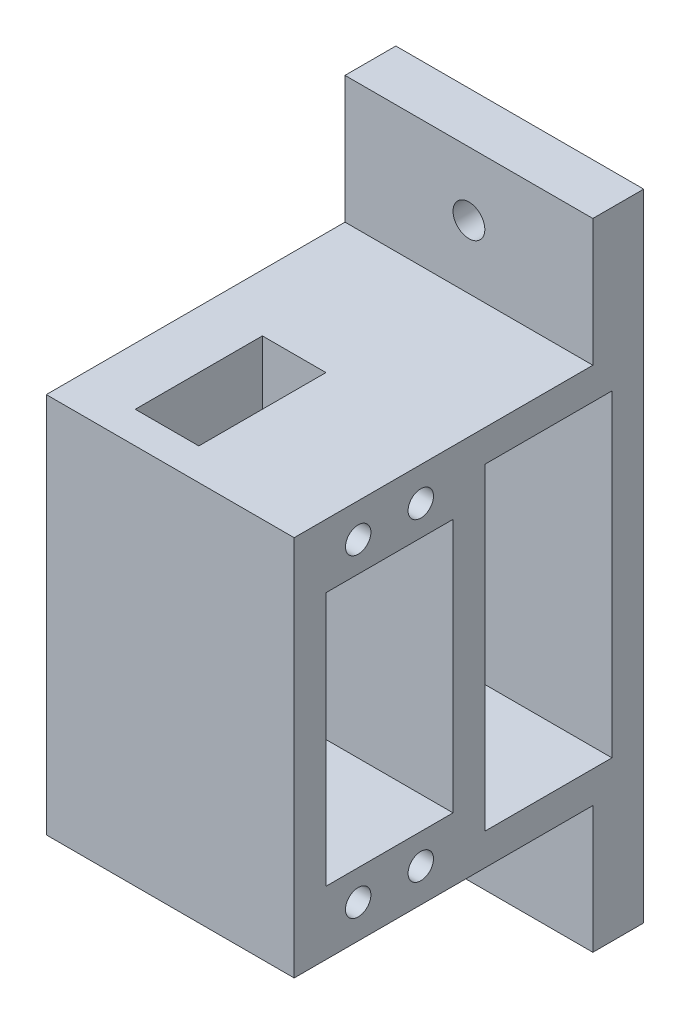
ISO-10303-21;
HEADER;
FILE_DESCRIPTION(('STEP AP214'),'2;1');
FILE_NAME('part.step','',(''),(''),'','','');
FILE_SCHEMA(('AUTOMOTIVE_DESIGN { 1 0 10303 214 1 1 1 1 }'));
ENDSEC;
DATA;
#1=APPLICATION_CONTEXT('core data for automotive mechanical design processes');
#2=APPLICATION_PROTOCOL_DEFINITION('international standard','automotive_design',2000,#1);
#3=PRODUCT_CONTEXT('',#1,'mechanical');
#4=PRODUCT('Part','Part','',(#3));
#5=PRODUCT_RELATED_PRODUCT_CATEGORY('part','',(#4));
#6=PRODUCT_DEFINITION_FORMATION('','',#4);
#7=PRODUCT_DEFINITION_CONTEXT('part definition',#1,'design');
#8=PRODUCT_DEFINITION('design','',#6,#7);
#9=PRODUCT_DEFINITION_SHAPE('','',#8);
#10=(LENGTH_UNIT() NAMED_UNIT(*) SI_UNIT(.MILLI.,.METRE.));
#11=(NAMED_UNIT(*) PLANE_ANGLE_UNIT() SI_UNIT($,.RADIAN.));
#12=(NAMED_UNIT(*) SI_UNIT($,.STERADIAN.) SOLID_ANGLE_UNIT());
#13=UNCERTAINTY_MEASURE_WITH_UNIT(LENGTH_MEASURE(1.E-05),#10,'distance_accuracy_value','');
#14=(GEOMETRIC_REPRESENTATION_CONTEXT(3) GLOBAL_UNCERTAINTY_ASSIGNED_CONTEXT((#13)) GLOBAL_UNIT_ASSIGNED_CONTEXT((#10,
#11,#12)) REPRESENTATION_CONTEXT('',''));
#15=CARTESIAN_POINT('',(0.,0.,0.));
#16=DIRECTION('',(0.,0.,1.));
#17=DIRECTION('',(1.,0.,0.));
#18=AXIS2_PLACEMENT_3D('',#15,#16,#17);
#19=CARTESIAN_POINT('',(39.,30.,-15.));
#20=DIRECTION('',(0.,-1.,0.));
#21=DIRECTION('',(0.,0.,1.));
#22=AXIS2_PLACEMENT_3D('',#19,#20,#21);
#23=PLANE('',#22);
#24=DIRECTION('',(1.,0.,0.));
#25=VECTOR('',#24,1.);
#26=CARTESIAN_POINT('',(9.,30.,-10.));
#27=LINE('',#26,#25);
#28=CARTESIAN_POINT('',(9.,30.,-10.));
#29=VERTEX_POINT('',#28);
#30=CARTESIAN_POINT('',(19.,30.,-10.));
#31=VERTEX_POINT('',#30);
#32=EDGE_CURVE('E252',#29,#31,#27,.T.);
#33=ORIENTED_EDGE('',*,*,#32,.T.);
#34=DIRECTION('',(0.,0.,1.));
#35=VECTOR('',#34,1.);
#36=CARTESIAN_POINT('',(19.,30.,-10.));
#37=LINE('',#36,#35);
#38=CARTESIAN_POINT('',(19.,30.,9.99999999999999));
#39=VERTEX_POINT('',#38);
#40=EDGE_CURVE('E249',#31,#39,#37,.T.);
#41=ORIENTED_EDGE('',*,*,#40,.T.);
#42=DIRECTION('',(-1.,0.,0.));
#43=VECTOR('',#42,1.);
#44=CARTESIAN_POINT('',(9.,30.,9.99999999999999));
#45=LINE('',#44,#43);
#46=CARTESIAN_POINT('',(9.,30.,9.99999999999999));
#47=VERTEX_POINT('',#46);
#48=EDGE_CURVE('E259',#39,#47,#45,.T.);
#49=ORIENTED_EDGE('',*,*,#48,.T.);
#50=DIRECTION('',(0.,0.,-1.));
#51=VECTOR('',#50,1.);
#52=CARTESIAN_POINT('',(9.,30.,-10.));
#53=LINE('',#52,#51);
#54=EDGE_CURVE('E256',#47,#29,#53,.T.);
#55=ORIENTED_EDGE('',*,*,#54,.T.);
#56=EDGE_LOOP('',(#33,#41,#49,#55));
#57=FACE_BOUND('',#56,.T.);
#58=DIRECTION('',(-1.,0.,0.));
#59=VECTOR('',#58,1.);
#60=CARTESIAN_POINT('',(39.,30.,-32.));
#61=LINE('',#60,#59);
#62=CARTESIAN_POINT('',(39.,30.,-32.));
#63=VERTEX_POINT('',#62);
#64=CARTESIAN_POINT('',(0.,30.,-32.));
#65=VERTEX_POINT('',#64);
#66=EDGE_CURVE('E180',#63,#65,#61,.T.);
#67=ORIENTED_EDGE('',*,*,#66,.T.);
#68=DIRECTION('',(0.,0.,-1.));
#69=VECTOR('',#68,1.);
#70=CARTESIAN_POINT('',(0.,30.,-15.));
#71=LINE('',#70,#69);
#72=CARTESIAN_POINT('',(0.,30.,15.));
#73=VERTEX_POINT('',#72);
#74=EDGE_CURVE('E328',#73,#65,#71,.T.);
#75=ORIENTED_EDGE('',*,*,#74,.F.);
#76=DIRECTION('',(-1.,0.,0.));
#77=VECTOR('',#76,1.);
#78=CARTESIAN_POINT('',(39.,30.,15.));
#79=LINE('',#78,#77);
#80=CARTESIAN_POINT('',(39.,30.,15.));
#81=VERTEX_POINT('',#80);
#82=EDGE_CURVE('E11',#81,#73,#79,.T.);
#83=ORIENTED_EDGE('',*,*,#82,.F.);
#84=DIRECTION('',(0.,0.,-1.));
#85=VECTOR('',#84,1.);
#86=CARTESIAN_POINT('',(39.,30.,-15.));
#87=LINE('',#86,#85);
#88=EDGE_CURVE('E321',#81,#63,#87,.T.);
#89=ORIENTED_EDGE('',*,*,#88,.T.);
#90=EDGE_LOOP('',(#67,#75,#83,#89));
#91=FACE_BOUND('',#90,.T.);
#92=ADVANCED_FACE('F39',(#57,#91),#23,.F.);
#93=CARTESIAN_POINT('',(39.,-30.,-15.));
#94=DIRECTION('',(0.,1.,0.));
#95=DIRECTION('',(0.,0.,-1.));
#96=AXIS2_PLACEMENT_3D('',#93,#94,#95);
#97=PLANE('',#96);
#98=DIRECTION('',(1.,0.,0.));
#99=VECTOR('',#98,1.);
#100=CARTESIAN_POINT('',(39.,-30.,-32.));
#101=LINE('',#100,#99);
#102=CARTESIAN_POINT('',(0.,-30.,-32.));
#103=VERTEX_POINT('',#102);
#104=CARTESIAN_POINT('',(39.,-30.,-32.));
#105=VERTEX_POINT('',#104);
#106=EDGE_CURVE('E181',#103,#105,#101,.T.);
#107=ORIENTED_EDGE('',*,*,#106,.T.);
#108=DIRECTION('',(0.,0.,1.));
#109=VECTOR('',#108,1.);
#110=CARTESIAN_POINT('',(39.,-30.,-15.));
#111=LINE('',#110,#109);
#112=CARTESIAN_POINT('',(39.,-30.,15.));
#113=VERTEX_POINT('',#112);
#114=EDGE_CURVE('E324',#105,#113,#111,.T.);
#115=ORIENTED_EDGE('',*,*,#114,.T.);
#116=DIRECTION('',(-1.,0.,0.));
#117=VECTOR('',#116,1.);
#118=CARTESIAN_POINT('',(39.,-30.,15.));
#119=LINE('',#118,#117);
#120=CARTESIAN_POINT('',(0.,-30.,15.));
#121=VERTEX_POINT('',#120);
#122=EDGE_CURVE('E47',#113,#121,#119,.T.);
#123=ORIENTED_EDGE('',*,*,#122,.T.);
#124=DIRECTION('',(0.,0.,1.));
#125=VECTOR('',#124,1.);
#126=CARTESIAN_POINT('',(0.,-30.,-15.));
#127=LINE('',#126,#125);
#128=EDGE_CURVE('E322',#103,#121,#127,.T.);
#129=ORIENTED_EDGE('',*,*,#128,.F.);
#130=EDGE_LOOP('',(#107,#115,#123,#129));
#131=FACE_BOUND('',#130,.T.);
#132=ADVANCED_FACE('F334',(#131),#97,.F.);
#133=CARTESIAN_POINT('',(39.,30.,15.));
#134=DIRECTION('',(0.,0.,-1.));
#135=DIRECTION('',(0.,-1.,0.));
#136=AXIS2_PLACEMENT_3D('',#133,#134,#135);
#137=PLANE('',#136);
#138=DIRECTION('',(0.,1.,0.));
#139=VECTOR('',#138,1.);
#140=CARTESIAN_POINT('',(0.,30.,15.));
#141=LINE('',#140,#139);
#142=EDGE_CURVE('E313',#121,#73,#141,.T.);
#143=ORIENTED_EDGE('',*,*,#142,.F.);
#144=ORIENTED_EDGE('',*,*,#122,.F.);
#145=DIRECTION('',(0.,1.,0.));
#146=VECTOR('',#145,1.);
#147=CARTESIAN_POINT('',(39.,30.,15.));
#148=LINE('',#147,#146);
#149=EDGE_CURVE('E319',#113,#81,#148,.T.);
#150=ORIENTED_EDGE('',*,*,#149,.T.);
#151=ORIENTED_EDGE('',*,*,#82,.T.);
#152=EDGE_LOOP('',(#143,#144,#150,#151));
#153=FACE_BOUND('',#152,.T.);
#154=ADVANCED_FACE('F41',(#153),#137,.F.);
#155=CARTESIAN_POINT('',(39.,0.,0.));
#156=DIRECTION('',(1.,0.,0.));
#157=DIRECTION('',(0.,0.,1.));
#158=AXIS2_PLACEMENT_3D('',#155,#156,#157);
#159=PLANE('',#158);
#160=DIRECTION('',(0.,-1.,0.));
#161=VECTOR('',#160,1.);
#162=CARTESIAN_POINT('',(39.,25.,-35.));
#163=LINE('',#162,#161);
#164=CARTESIAN_POINT('',(39.,25.,-35.));
#165=VERTEX_POINT('',#164);
#166=CARTESIAN_POINT('',(39.,-25.,-35.));
#167=VERTEX_POINT('',#166);
#168=EDGE_CURVE('E212',#165,#167,#163,.T.);
#169=ORIENTED_EDGE('',*,*,#168,.T.);
#170=DIRECTION('',(0.,0.,1.));
#171=VECTOR('',#170,1.);
#172=CARTESIAN_POINT('',(39.,-25.,-35.));
#173=LINE('',#172,#171);
#174=CARTESIAN_POINT('',(39.,-25.,-15.));
#175=VERTEX_POINT('',#174);
#176=EDGE_CURVE('E226',#167,#175,#173,.T.);
#177=ORIENTED_EDGE('',*,*,#176,.T.);
#178=DIRECTION('',(0.,1.,0.));
#179=VECTOR('',#178,1.);
#180=CARTESIAN_POINT('',(39.,25.,-15.));
#181=LINE('',#180,#179);
#182=CARTESIAN_POINT('',(39.,25.,-15.));
#183=VERTEX_POINT('',#182);
#184=EDGE_CURVE('E229',#175,#183,#181,.T.);
#185=ORIENTED_EDGE('',*,*,#184,.T.);
#186=DIRECTION('',(0.,0.,-1.));
#187=VECTOR('',#186,1.);
#188=CARTESIAN_POINT('',(39.,25.,-35.));
#189=LINE('',#188,#187);
#190=EDGE_CURVE('E232',#183,#165,#189,.T.);
#191=ORIENTED_EDGE('',*,*,#190,.T.);
#192=EDGE_LOOP('',(#169,#177,#185,#191));
#193=FACE_BOUND('',#192,.T.);
#194=CARTESIAN_POINT('',(39.,-24.71,-4.925));
#195=DIRECTION('',(-1.,0.,0.));
#196=DIRECTION('',(0.,0.,-1.));
#197=AXIS2_PLACEMENT_3D('',#194,#195,#196);
#198=CIRCLE('',#197,2.);
#199=CARTESIAN_POINT('',(39.,-24.71,-6.925));
#200=VERTEX_POINT('',#199);
#201=EDGE_CURVE('E285',#200,#200,#198,.T.);
#202=ORIENTED_EDGE('',*,*,#201,.T.);
#203=EDGE_LOOP('',(#202));
#204=FACE_BOUND('',#203,.T.);
#205=CARTESIAN_POINT('',(39.,-24.71,4.925));
#206=DIRECTION('',(-1.,0.,0.));
#207=DIRECTION('',(0.,0.,-1.));
#208=AXIS2_PLACEMENT_3D('',#205,#206,#207);
#209=CIRCLE('',#208,2.);
#210=CARTESIAN_POINT('',(39.,-24.71,2.925));
#211=VERTEX_POINT('',#210);
#212=EDGE_CURVE('E279',#211,#211,#209,.T.);
#213=ORIENTED_EDGE('',*,*,#212,.T.);
#214=EDGE_LOOP('',(#213));
#215=FACE_BOUND('',#214,.T.);
#216=CARTESIAN_POINT('',(39.,24.71,4.925));
#217=DIRECTION('',(-1.,0.,0.));
#218=DIRECTION('',(0.,0.,1.));
#219=AXIS2_PLACEMENT_3D('',#216,#217,#218);
#220=CIRCLE('',#219,2.00000000000001);
#221=CARTESIAN_POINT('',(39.,24.71,6.92500000000001));
#222=VERTEX_POINT('',#221);
#223=EDGE_CURVE('E272',#222,#222,#220,.T.);
#224=ORIENTED_EDGE('',*,*,#223,.T.);
#225=EDGE_LOOP('',(#224));
#226=FACE_BOUND('',#225,.T.);
#227=CARTESIAN_POINT('',(39.,24.71,-4.925));
#228=DIRECTION('',(-1.,0.,0.));
#229=DIRECTION('',(0.,0.,1.));
#230=AXIS2_PLACEMENT_3D('',#227,#228,#229);
#231=CIRCLE('',#230,2.);
#232=CARTESIAN_POINT('',(39.,24.71,-2.92499999999999));
#233=VERTEX_POINT('',#232);
#234=EDGE_CURVE('E275',#233,#233,#231,.T.);
#235=ORIENTED_EDGE('',*,*,#234,.T.);
#236=EDGE_LOOP('',(#235));
#237=FACE_BOUND('',#236,.T.);
#238=DIRECTION('',(0.,1.,0.));
#239=VECTOR('',#238,1.);
#240=CARTESIAN_POINT('',(39.,20.,9.99999999999999));
#241=LINE('',#240,#239);
#242=CARTESIAN_POINT('',(39.,-20.,10.));
#243=VERTEX_POINT('',#242);
#244=CARTESIAN_POINT('',(39.,20.,9.99999999999999));
#245=VERTEX_POINT('',#244);
#246=EDGE_CURVE('E292',#243,#245,#241,.T.);
#247=ORIENTED_EDGE('',*,*,#246,.T.);
#248=DIRECTION('',(0.,0.,-1.));
#249=VECTOR('',#248,1.);
#250=CARTESIAN_POINT('',(39.,20.,-10.));
#251=LINE('',#250,#249);
#252=CARTESIAN_POINT('',(39.,20.,-10.));
#253=VERTEX_POINT('',#252);
#254=EDGE_CURVE('E303',#245,#253,#251,.T.);
#255=ORIENTED_EDGE('',*,*,#254,.T.);
#256=DIRECTION('',(0.,-1.,0.));
#257=VECTOR('',#256,1.);
#258=CARTESIAN_POINT('',(39.,20.,-10.));
#259=LINE('',#258,#257);
#260=CARTESIAN_POINT('',(39.,-20.,-10.));
#261=VERTEX_POINT('',#260);
#262=EDGE_CURVE('E306',#253,#261,#259,.T.);
#263=ORIENTED_EDGE('',*,*,#262,.T.);
#264=DIRECTION('',(0.,0.,1.));
#265=VECTOR('',#264,1.);
#266=CARTESIAN_POINT('',(39.,-20.,-10.));
#267=LINE('',#266,#265);
#268=EDGE_CURVE('E296',#261,#243,#267,.T.);
#269=ORIENTED_EDGE('',*,*,#268,.T.);
#270=EDGE_LOOP('',(#247,#255,#263,#269));
#271=FACE_BOUND('',#270,.T.);
#272=ORIENTED_EDGE('',*,*,#149,.F.);
#273=ORIENTED_EDGE('',*,*,#114,.F.);
#274=DIRECTION('',(0.,1.,0.));
#275=VECTOR('',#274,1.);
#276=CARTESIAN_POINT('',(39.,-50.,-32.));
#277=LINE('',#276,#275);
#278=CARTESIAN_POINT('',(39.,-50.,-32.));
#279=VERTEX_POINT('',#278);
#280=EDGE_CURVE('E207',#279,#105,#277,.T.);
#281=ORIENTED_EDGE('',*,*,#280,.F.);
#282=DIRECTION('',(0.,0.,-1.));
#283=VECTOR('',#282,1.);
#284=CARTESIAN_POINT('',(39.,-50.,-32.));
#285=LINE('',#284,#283);
#286=CARTESIAN_POINT('',(39.,-50.,-40.));
#287=VERTEX_POINT('',#286);
#288=EDGE_CURVE('E199',#279,#287,#285,.T.);
#289=ORIENTED_EDGE('',*,*,#288,.T.);
#290=DIRECTION('',(0.,1.,0.));
#291=VECTOR('',#290,1.);
#292=CARTESIAN_POINT('',(39.,30.,-40.));
#293=LINE('',#292,#291);
#294=CARTESIAN_POINT('',(39.,50.,-40.));
#295=VERTEX_POINT('',#294);
#296=EDGE_CURVE('E187',#287,#295,#293,.T.);
#297=ORIENTED_EDGE('',*,*,#296,.T.);
#298=DIRECTION('',(0.,0.,1.));
#299=VECTOR('',#298,1.);
#300=CARTESIAN_POINT('',(39.,50.,-40.));
#301=LINE('',#300,#299);
#302=CARTESIAN_POINT('',(39.,50.,-32.));
#303=VERTEX_POINT('',#302);
#304=EDGE_CURVE('E170',#295,#303,#301,.T.);
#305=ORIENTED_EDGE('',*,*,#304,.T.);
#306=DIRECTION('',(0.,-1.,0.));
#307=VECTOR('',#306,1.);
#308=CARTESIAN_POINT('',(39.,50.,-32.));
#309=LINE('',#308,#307);
#310=EDGE_CURVE('E54',#303,#63,#309,.T.);
#311=ORIENTED_EDGE('',*,*,#310,.T.);
#312=ORIENTED_EDGE('',*,*,#88,.F.);
#313=EDGE_LOOP('',(#272,#273,#281,#289,#297,#305,#311,#312));
#314=FACE_BOUND('',#313,.T.);
#315=ADVANCED_FACE('F184',(#193,#204,#215,#226,#237,#271,#314),#159,.T.);
#316=CARTESIAN_POINT('',(0.,0.,0.));
#317=DIRECTION('',(1.,0.,0.));
#318=DIRECTION('',(0.,0.,1.));
#319=AXIS2_PLACEMENT_3D('',#316,#317,#318);
#320=PLANE('',#319);
#321=DIRECTION('',(0.,0.,1.));
#322=VECTOR('',#321,1.);
#323=CARTESIAN_POINT('',(0.,25.,-35.));
#324=LINE('',#323,#322);
#325=CARTESIAN_POINT('',(0.,25.,-35.));
#326=VERTEX_POINT('',#325);
#327=CARTESIAN_POINT('',(0.,25.,-15.));
#328=VERTEX_POINT('',#327);
#329=EDGE_CURVE('E216',#326,#328,#324,.T.);
#330=ORIENTED_EDGE('',*,*,#329,.T.);
#331=DIRECTION('',(0.,-1.,0.));
#332=VECTOR('',#331,1.);
#333=CARTESIAN_POINT('',(0.,25.,-15.));
#334=LINE('',#333,#332);
#335=CARTESIAN_POINT('',(0.,-25.,-15.));
#336=VERTEX_POINT('',#335);
#337=EDGE_CURVE('E213',#328,#336,#334,.T.);
#338=ORIENTED_EDGE('',*,*,#337,.T.);
#339=DIRECTION('',(0.,0.,-1.));
#340=VECTOR('',#339,1.);
#341=CARTESIAN_POINT('',(0.,-25.,-35.));
#342=LINE('',#341,#340);
#343=CARTESIAN_POINT('',(0.,-25.,-35.));
#344=VERTEX_POINT('',#343);
#345=EDGE_CURVE('E223',#336,#344,#342,.T.);
#346=ORIENTED_EDGE('',*,*,#345,.T.);
#347=DIRECTION('',(0.,1.,0.));
#348=VECTOR('',#347,1.);
#349=CARTESIAN_POINT('',(0.,25.,-35.));
#350=LINE('',#349,#348);
#351=EDGE_CURVE('E220',#344,#326,#350,.T.);
#352=ORIENTED_EDGE('',*,*,#351,.T.);
#353=EDGE_LOOP('',(#330,#338,#346,#352));
#354=FACE_BOUND('',#353,.T.);
#355=ORIENTED_EDGE('',*,*,#142,.T.);
#356=ORIENTED_EDGE('',*,*,#74,.T.);
#357=DIRECTION('',(0.,-1.,0.));
#358=VECTOR('',#357,1.);
#359=CARTESIAN_POINT('',(0.,50.,-32.));
#360=LINE('',#359,#358);
#361=CARTESIAN_POINT('',(0.,50.,-32.));
#362=VERTEX_POINT('',#361);
#363=EDGE_CURVE('E182',#362,#65,#360,.T.);
#364=ORIENTED_EDGE('',*,*,#363,.F.);
#365=DIRECTION('',(0.,0.,-1.));
#366=VECTOR('',#365,1.);
#367=CARTESIAN_POINT('',(0.,50.,-40.));
#368=LINE('',#367,#366);
#369=CARTESIAN_POINT('',(0.,50.,-40.));
#370=VERTEX_POINT('',#369);
#371=EDGE_CURVE('E173',#362,#370,#368,.T.);
#372=ORIENTED_EDGE('',*,*,#371,.T.);
#373=DIRECTION('',(0.,-1.,0.));
#374=VECTOR('',#373,1.);
#375=CARTESIAN_POINT('',(0.,30.,-40.));
#376=LINE('',#375,#374);
#377=CARTESIAN_POINT('',(0.,-50.,-40.));
#378=VERTEX_POINT('',#377);
#379=EDGE_CURVE('E244',#370,#378,#376,.T.);
#380=ORIENTED_EDGE('',*,*,#379,.T.);
#381=DIRECTION('',(0.,0.,1.));
#382=VECTOR('',#381,1.);
#383=CARTESIAN_POINT('',(0.,-50.,-32.));
#384=LINE('',#383,#382);
#385=CARTESIAN_POINT('',(0.,-50.,-32.));
#386=VERTEX_POINT('',#385);
#387=EDGE_CURVE('E203',#378,#386,#384,.T.);
#388=ORIENTED_EDGE('',*,*,#387,.T.);
#389=DIRECTION('',(0.,1.,0.));
#390=VECTOR('',#389,1.);
#391=CARTESIAN_POINT('',(0.,-50.,-32.));
#392=LINE('',#391,#390);
#393=EDGE_CURVE('E62',#386,#103,#392,.T.);
#394=ORIENTED_EDGE('',*,*,#393,.T.);
#395=ORIENTED_EDGE('',*,*,#128,.T.);
#396=EDGE_LOOP('',(#355,#356,#364,#372,#380,#388,#394,#395));
#397=FACE_BOUND('',#396,.T.);
#398=ADVANCED_FACE('F340',(#354,#397),#320,.F.);
#399=CARTESIAN_POINT('',(9.,20.,9.99999999999999));
#400=DIRECTION('',(0.,0.,1.));
#401=DIRECTION('',(0.,1.,0.));
#402=AXIS2_PLACEMENT_3D('',#399,#400,#401);
#403=PLANE('',#402);
#404=ORIENTED_EDGE('',*,*,#246,.F.);
#405=DIRECTION('',(1.,0.,0.));
#406=VECTOR('',#405,1.);
#407=CARTESIAN_POINT('',(9.,-20.,10.));
#408=LINE('',#407,#406);
#409=CARTESIAN_POINT('',(9.,-20.,10.));
#410=VERTEX_POINT('',#409);
#411=EDGE_CURVE('E311',#410,#243,#408,.T.);
#412=ORIENTED_EDGE('',*,*,#411,.F.);
#413=DIRECTION('',(0.,1.,0.));
#414=VECTOR('',#413,1.);
#415=CARTESIAN_POINT('',(9.,20.,9.99999999999999));
#416=LINE('',#415,#414);
#417=EDGE_CURVE('E293',#410,#47,#416,.T.);
#418=ORIENTED_EDGE('',*,*,#417,.T.);
#419=ORIENTED_EDGE('',*,*,#48,.F.);
#420=DIRECTION('',(0.,-1.,0.));
#421=VECTOR('',#420,1.);
#422=CARTESIAN_POINT('',(19.,52.3606797749979,9.99999999999999));
#423=LINE('',#422,#421);
#424=CARTESIAN_POINT('',(19.,20.,9.99999999999999));
#425=VERTEX_POINT('',#424);
#426=EDGE_CURVE('E261',#39,#425,#423,.T.);
#427=ORIENTED_EDGE('',*,*,#426,.T.);
#428=DIRECTION('',(1.,0.,0.));
#429=VECTOR('',#428,1.);
#430=CARTESIAN_POINT('',(9.,20.,9.99999999999999));
#431=LINE('',#430,#429);
#432=EDGE_CURVE('E300',#425,#245,#431,.T.);
#433=ORIENTED_EDGE('',*,*,#432,.T.);
#434=EDGE_LOOP('',(#404,#412,#418,#419,#427,#433));
#435=FACE_BOUND('',#434,.T.);
#436=ADVANCED_FACE('F342',(#435),#403,.F.);
#437=CARTESIAN_POINT('',(9.,-20.,-10.));
#438=DIRECTION('',(0.,-1.,0.));
#439=DIRECTION('',(0.,0.,1.));
#440=AXIS2_PLACEMENT_3D('',#437,#438,#439);
#441=PLANE('',#440);
#442=ORIENTED_EDGE('',*,*,#268,.F.);
#443=DIRECTION('',(1.,0.,0.));
#444=VECTOR('',#443,1.);
#445=CARTESIAN_POINT('',(9.,-20.,-10.));
#446=LINE('',#445,#444);
#447=CARTESIAN_POINT('',(9.,-20.,-10.));
#448=VERTEX_POINT('',#447);
#449=EDGE_CURVE('E314',#448,#261,#446,.T.);
#450=ORIENTED_EDGE('',*,*,#449,.F.);
#451=DIRECTION('',(0.,0.,1.));
#452=VECTOR('',#451,1.);
#453=CARTESIAN_POINT('',(9.,-20.,-10.));
#454=LINE('',#453,#452);
#455=EDGE_CURVE('E298',#448,#410,#454,.T.);
#456=ORIENTED_EDGE('',*,*,#455,.T.);
#457=ORIENTED_EDGE('',*,*,#411,.T.);
#458=EDGE_LOOP('',(#442,#450,#456,#457));
#459=FACE_BOUND('',#458,.T.);
#460=ADVANCED_FACE('F349',(#459),#441,.F.);
#461=CARTESIAN_POINT('',(9.,20.,-10.));
#462=DIRECTION('',(0.,0.,-1.));
#463=DIRECTION('',(0.,-1.,0.));
#464=AXIS2_PLACEMENT_3D('',#461,#462,#463);
#465=PLANE('',#464);
#466=ORIENTED_EDGE('',*,*,#262,.F.);
#467=DIRECTION('',(1.,0.,0.));
#468=VECTOR('',#467,1.);
#469=CARTESIAN_POINT('',(9.,20.,-10.));
#470=LINE('',#469,#468);
#471=CARTESIAN_POINT('',(19.,20.,-10.));
#472=VERTEX_POINT('',#471);
#473=EDGE_CURVE('E316',#472,#253,#470,.T.);
#474=ORIENTED_EDGE('',*,*,#473,.F.);
#475=DIRECTION('',(0.,-1.,0.));
#476=VECTOR('',#475,1.);
#477=CARTESIAN_POINT('',(19.,52.3606797749979,-10.));
#478=LINE('',#477,#476);
#479=EDGE_CURVE('E253',#31,#472,#478,.T.);
#480=ORIENTED_EDGE('',*,*,#479,.F.);
#481=ORIENTED_EDGE('',*,*,#32,.F.);
#482=DIRECTION('',(0.,-1.,0.));
#483=VECTOR('',#482,1.);
#484=CARTESIAN_POINT('',(9.,20.,-10.));
#485=LINE('',#484,#483);
#486=EDGE_CURVE('E295',#29,#448,#485,.T.);
#487=ORIENTED_EDGE('',*,*,#486,.T.);
#488=ORIENTED_EDGE('',*,*,#449,.T.);
#489=EDGE_LOOP('',(#466,#474,#480,#481,#487,#488));
#490=FACE_BOUND('',#489,.T.);
#491=ADVANCED_FACE('F421',(#490),#465,.F.);
#492=CARTESIAN_POINT('',(9.,20.,-10.));
#493=DIRECTION('',(0.,1.,0.));
#494=DIRECTION('',(0.,0.,-1.));
#495=AXIS2_PLACEMENT_3D('',#492,#493,#494);
#496=PLANE('',#495);
#497=ORIENTED_EDGE('',*,*,#473,.T.);
#498=ORIENTED_EDGE('',*,*,#254,.F.);
#499=ORIENTED_EDGE('',*,*,#432,.F.);
#500=DIRECTION('',(0.,0.,-1.));
#501=VECTOR('',#500,1.);
#502=CARTESIAN_POINT('',(19.,20.,-10.));
#503=LINE('',#502,#501);
#504=EDGE_CURVE('E248',#425,#472,#503,.T.);
#505=ORIENTED_EDGE('',*,*,#504,.T.);
#506=EDGE_LOOP('',(#497,#498,#499,#505));
#507=FACE_BOUND('',#506,.T.);
#508=ADVANCED_FACE('F417',(#507),#496,.F.);
#509=CARTESIAN_POINT('',(9.,0.,0.));
#510=DIRECTION('',(1.,0.,0.));
#511=DIRECTION('',(0.,0.,1.));
#512=AXIS2_PLACEMENT_3D('',#509,#510,#511);
#513=PLANE('',#512);
#514=ORIENTED_EDGE('',*,*,#417,.F.);
#515=ORIENTED_EDGE('',*,*,#455,.F.);
#516=ORIENTED_EDGE('',*,*,#486,.F.);
#517=ORIENTED_EDGE('',*,*,#54,.F.);
#518=EDGE_LOOP('',(#514,#515,#516,#517));
#519=FACE_BOUND('',#518,.T.);
#520=ADVANCED_FACE('F413',(#519),#513,.T.);
#521=CARTESIAN_POINT('',(19.,24.71,-4.925));
#522=DIRECTION('',(1.,0.,0.));
#523=DIRECTION('',(0.,0.,1.));
#524=AXIS2_PLACEMENT_3D('',#521,#522,#523);
#525=CYLINDRICAL_SURFACE('',#524,2.);
#526=CARTESIAN_POINT('',(19.,24.71,-4.925));
#527=DIRECTION('',(-1.,0.,0.));
#528=DIRECTION('',(0.,0.,1.));
#529=AXIS2_PLACEMENT_3D('',#526,#527,#528);
#530=CIRCLE('',#529,2.);
#531=CARTESIAN_POINT('',(19.,24.71,-2.92499999999999));
#532=VERTEX_POINT('',#531);
#533=EDGE_CURVE('E271',#532,#532,#530,.T.);
#534=ORIENTED_EDGE('',*,*,#533,.T.);
#535=EDGE_LOOP('',(#534));
#536=FACE_BOUND('',#535,.T.);
#537=ORIENTED_EDGE('',*,*,#234,.F.);
#538=EDGE_LOOP('',(#537));
#539=FACE_BOUND('',#538,.T.);
#540=ADVANCED_FACE('F395',(#536,#539),#525,.F.);
#541=CARTESIAN_POINT('',(19.,24.71,4.925));
#542=DIRECTION('',(1.,0.,0.));
#543=DIRECTION('',(0.,0.,1.));
#544=AXIS2_PLACEMENT_3D('',#541,#542,#543);
#545=CYLINDRICAL_SURFACE('',#544,2.00000000000001);
#546=CARTESIAN_POINT('',(19.,24.71,4.925));
#547=DIRECTION('',(-1.,0.,0.));
#548=DIRECTION('',(0.,0.,1.));
#549=AXIS2_PLACEMENT_3D('',#546,#547,#548);
#550=CIRCLE('',#549,2.00000000000001);
#551=CARTESIAN_POINT('',(19.,24.71,6.92500000000001));
#552=VERTEX_POINT('',#551);
#553=EDGE_CURVE('E268',#552,#552,#550,.T.);
#554=ORIENTED_EDGE('',*,*,#553,.T.);
#555=EDGE_LOOP('',(#554));
#556=FACE_BOUND('',#555,.T.);
#557=ORIENTED_EDGE('',*,*,#223,.F.);
#558=EDGE_LOOP('',(#557));
#559=FACE_BOUND('',#558,.T.);
#560=ADVANCED_FACE('F391',(#556,#559),#545,.F.);
#561=CARTESIAN_POINT('',(19.,-24.71,4.925));
#562=DIRECTION('',(1.,0.,0.));
#563=DIRECTION('',(0.,0.,1.));
#564=AXIS2_PLACEMENT_3D('',#561,#562,#563);
#565=CYLINDRICAL_SURFACE('',#564,2.);
#566=CARTESIAN_POINT('',(19.,-24.71,4.925));
#567=DIRECTION('',(-1.,0.,0.));
#568=DIRECTION('',(0.,0.,-1.));
#569=AXIS2_PLACEMENT_3D('',#566,#567,#568);
#570=CIRCLE('',#569,2.);
#571=CARTESIAN_POINT('',(19.,-24.71,2.925));
#572=VERTEX_POINT('',#571);
#573=EDGE_CURVE('E276',#572,#572,#570,.T.);
#574=ORIENTED_EDGE('',*,*,#573,.T.);
#575=EDGE_LOOP('',(#574));
#576=FACE_BOUND('',#575,.T.);
#577=ORIENTED_EDGE('',*,*,#212,.F.);
#578=EDGE_LOOP('',(#577));
#579=FACE_BOUND('',#578,.T.);
#580=ADVANCED_FACE('F394',(#576,#579),#565,.F.);
#581=CARTESIAN_POINT('',(19.,-24.71,4.925));
#582=DIRECTION('',(-1.,0.,0.));
#583=DIRECTION('',(0.,0.,-1.));
#584=AXIS2_PLACEMENT_3D('',#581,#582,#583);
#585=PLANE('',#584);
#586=ORIENTED_EDGE('',*,*,#573,.F.);
#587=EDGE_LOOP('',(#586));
#588=FACE_BOUND('',#587,.T.);
#589=ADVANCED_FACE('F397',(#588),#585,.F.);
#590=CARTESIAN_POINT('',(19.,-24.71,-4.925));
#591=DIRECTION('',(1.,0.,0.));
#592=DIRECTION('',(0.,0.,1.));
#593=AXIS2_PLACEMENT_3D('',#590,#591,#592);
#594=CYLINDRICAL_SURFACE('',#593,2.);
#595=CARTESIAN_POINT('',(19.,-24.71,-4.925));
#596=DIRECTION('',(-1.,0.,0.));
#597=DIRECTION('',(0.,0.,-1.));
#598=AXIS2_PLACEMENT_3D('',#595,#596,#597);
#599=CIRCLE('',#598,2.);
#600=CARTESIAN_POINT('',(19.,-24.71,-6.925));
#601=VERTEX_POINT('',#600);
#602=EDGE_CURVE('E282',#601,#601,#599,.T.);
#603=ORIENTED_EDGE('',*,*,#602,.T.);
#604=EDGE_LOOP('',(#603));
#605=FACE_BOUND('',#604,.T.);
#606=ORIENTED_EDGE('',*,*,#201,.F.);
#607=EDGE_LOOP('',(#606));
#608=FACE_BOUND('',#607,.T.);
#609=ADVANCED_FACE('F400',(#605,#608),#594,.F.);
#610=CARTESIAN_POINT('',(19.,-24.71,-4.925));
#611=DIRECTION('',(-1.,0.,0.));
#612=DIRECTION('',(0.,0.,-1.));
#613=AXIS2_PLACEMENT_3D('',#610,#611,#612);
#614=PLANE('',#613);
#615=ORIENTED_EDGE('',*,*,#602,.F.);
#616=EDGE_LOOP('',(#615));
#617=FACE_BOUND('',#616,.T.);
#618=ADVANCED_FACE('F384',(#617),#614,.F.);
#619=CARTESIAN_POINT('',(19.,52.3606797749979,-10.));
#620=DIRECTION('',(1.,0.,0.));
#621=DIRECTION('',(0.,0.,1.));
#622=AXIS2_PLACEMENT_3D('',#619,#620,#621);
#623=PLANE('',#622);
#624=ORIENTED_EDGE('',*,*,#533,.F.);
#625=EDGE_LOOP('',(#624));
#626=FACE_BOUND('',#625,.T.);
#627=ORIENTED_EDGE('',*,*,#553,.F.);
#628=EDGE_LOOP('',(#627));
#629=FACE_BOUND('',#628,.T.);
#630=ORIENTED_EDGE('',*,*,#40,.F.);
#631=ORIENTED_EDGE('',*,*,#479,.T.);
#632=ORIENTED_EDGE('',*,*,#504,.F.);
#633=ORIENTED_EDGE('',*,*,#426,.F.);
#634=EDGE_LOOP('',(#630,#631,#632,#633));
#635=FACE_BOUND('',#634,.T.);
#636=ADVANCED_FACE('F374',(#626,#629,#635),#623,.F.);
#637=CARTESIAN_POINT('',(0.,0.,-40.));
#638=DIRECTION('',(0.,0.,-1.));
#639=DIRECTION('',(1.,0.,0.));
#640=AXIS2_PLACEMENT_3D('',#637,#638,#639);
#641=PLANE('',#640);
#642=CARTESIAN_POINT('',(19.5,-40.,-40.));
#643=DIRECTION('',(0.,0.,1.));
#644=DIRECTION('',(1.,0.,0.));
#645=AXIS2_PLACEMENT_3D('',#642,#643,#644);
#646=CIRCLE('',#645,2.5);
#647=CARTESIAN_POINT('',(22.,-40.,-40.));
#648=VERTEX_POINT('',#647);
#649=EDGE_CURVE('E189',#648,#648,#646,.F.);
#650=ORIENTED_EDGE('',*,*,#649,.F.);
#651=EDGE_LOOP('',(#650));
#652=FACE_BOUND('',#651,.T.);
#653=CARTESIAN_POINT('',(19.5,40.,-40.));
#654=DIRECTION('',(0.,0.,1.));
#655=DIRECTION('',(1.,0.,0.));
#656=AXIS2_PLACEMENT_3D('',#653,#654,#655);
#657=CIRCLE('',#656,2.5);
#658=CARTESIAN_POINT('',(22.,40.,-40.));
#659=VERTEX_POINT('',#658);
#660=EDGE_CURVE('E192',#659,#659,#657,.F.);
#661=ORIENTED_EDGE('',*,*,#660,.F.);
#662=EDGE_LOOP('',(#661));
#663=FACE_BOUND('',#662,.T.);
#664=ORIENTED_EDGE('',*,*,#379,.F.);
#665=DIRECTION('',(1.,0.,0.));
#666=VECTOR('',#665,1.);
#667=CARTESIAN_POINT('',(39.,50.,-40.));
#668=LINE('',#667,#666);
#669=EDGE_CURVE('E196',#370,#295,#668,.T.);
#670=ORIENTED_EDGE('',*,*,#669,.T.);
#671=ORIENTED_EDGE('',*,*,#296,.F.);
#672=DIRECTION('',(-1.,0.,0.));
#673=VECTOR('',#672,1.);
#674=CARTESIAN_POINT('',(39.,-50.,-40.));
#675=LINE('',#674,#673);
#676=EDGE_CURVE('E201',#287,#378,#675,.T.);
#677=ORIENTED_EDGE('',*,*,#676,.T.);
#678=EDGE_LOOP('',(#664,#670,#671,#677));
#679=FACE_BOUND('',#678,.T.);
#680=ADVANCED_FACE('F371',(#652,#663,#679),#641,.T.);
#681=CARTESIAN_POINT('',(-53.851648071345,25.,-35.));
#682=DIRECTION('',(0.,0.,-1.));
#683=DIRECTION('',(0.,-1.,0.));
#684=AXIS2_PLACEMENT_3D('',#681,#682,#683);
#685=PLANE('',#684);
#686=ORIENTED_EDGE('',*,*,#351,.F.);
#687=DIRECTION('',(1.,0.,0.));
#688=VECTOR('',#687,1.);
#689=CARTESIAN_POINT('',(-53.851648071345,-25.,-35.));
#690=LINE('',#689,#688);
#691=EDGE_CURVE('E235',#344,#167,#690,.T.);
#692=ORIENTED_EDGE('',*,*,#691,.T.);
#693=ORIENTED_EDGE('',*,*,#168,.F.);
#694=DIRECTION('',(1.,0.,0.));
#695=VECTOR('',#694,1.);
#696=CARTESIAN_POINT('',(-53.851648071345,25.,-35.));
#697=LINE('',#696,#695);
#698=EDGE_CURVE('E217',#326,#165,#697,.T.);
#699=ORIENTED_EDGE('',*,*,#698,.F.);
#700=EDGE_LOOP('',(#686,#692,#693,#699));
#701=FACE_BOUND('',#700,.T.);
#702=ADVANCED_FACE('F373',(#701),#685,.F.);
#703=CARTESIAN_POINT('',(-53.851648071345,25.,-35.));
#704=DIRECTION('',(0.,1.,0.));
#705=DIRECTION('',(0.,0.,-1.));
#706=AXIS2_PLACEMENT_3D('',#703,#704,#705);
#707=PLANE('',#706);
#708=ORIENTED_EDGE('',*,*,#329,.F.);
#709=ORIENTED_EDGE('',*,*,#698,.T.);
#710=ORIENTED_EDGE('',*,*,#190,.F.);
#711=DIRECTION('',(1.,0.,0.));
#712=VECTOR('',#711,1.);
#713=CARTESIAN_POINT('',(-53.851648071345,25.,-15.));
#714=LINE('',#713,#712);
#715=EDGE_CURVE('E237',#328,#183,#714,.T.);
#716=ORIENTED_EDGE('',*,*,#715,.F.);
#717=EDGE_LOOP('',(#708,#709,#710,#716));
#718=FACE_BOUND('',#717,.T.);
#719=ADVANCED_FACE('F381',(#718),#707,.F.);
#720=CARTESIAN_POINT('',(-53.851648071345,25.,-15.));
#721=DIRECTION('',(0.,0.,1.));
#722=DIRECTION('',(0.,1.,0.));
#723=AXIS2_PLACEMENT_3D('',#720,#721,#722);
#724=PLANE('',#723);
#725=ORIENTED_EDGE('',*,*,#337,.F.);
#726=ORIENTED_EDGE('',*,*,#715,.T.);
#727=ORIENTED_EDGE('',*,*,#184,.F.);
#728=DIRECTION('',(1.,0.,0.));
#729=VECTOR('',#728,1.);
#730=CARTESIAN_POINT('',(-53.851648071345,-25.,-15.));
#731=LINE('',#730,#729);
#732=EDGE_CURVE('E239',#336,#175,#731,.T.);
#733=ORIENTED_EDGE('',*,*,#732,.F.);
#734=EDGE_LOOP('',(#725,#726,#727,#733));
#735=FACE_BOUND('',#734,.T.);
#736=ADVANCED_FACE('F500',(#735),#724,.F.);
#737=CARTESIAN_POINT('',(-53.851648071345,-25.,-35.));
#738=DIRECTION('',(0.,-1.,0.));
#739=DIRECTION('',(0.,0.,1.));
#740=AXIS2_PLACEMENT_3D('',#737,#738,#739);
#741=PLANE('',#740);
#742=ORIENTED_EDGE('',*,*,#345,.F.);
#743=ORIENTED_EDGE('',*,*,#732,.T.);
#744=ORIENTED_EDGE('',*,*,#176,.F.);
#745=ORIENTED_EDGE('',*,*,#691,.F.);
#746=EDGE_LOOP('',(#742,#743,#744,#745));
#747=FACE_BOUND('',#746,.T.);
#748=ADVANCED_FACE('F510',(#747),#741,.F.);
#749=CARTESIAN_POINT('',(39.,-50.,-32.));
#750=DIRECTION('',(0.,0.,-1.));
#751=DIRECTION('',(1.,0.,0.));
#752=AXIS2_PLACEMENT_3D('',#749,#750,#751);
#753=PLANE('',#752);
#754=CARTESIAN_POINT('',(19.5,-40.,-32.));
#755=DIRECTION('',(0.,0.,-1.));
#756=DIRECTION('',(-1.,0.,0.));
#757=AXIS2_PLACEMENT_3D('',#754,#755,#756);
#758=CIRCLE('',#757,2.5);
#759=CARTESIAN_POINT('',(17.,-40.,-32.));
#760=VERTEX_POINT('',#759);
#761=EDGE_CURVE('E580',#760,#760,#758,.T.);
#762=ORIENTED_EDGE('',*,*,#761,.T.);
#763=EDGE_LOOP('',(#762));
#764=FACE_BOUND('',#763,.T.);
#765=ORIENTED_EDGE('',*,*,#106,.F.);
#766=ORIENTED_EDGE('',*,*,#393,.F.);
#767=DIRECTION('',(1.,0.,0.));
#768=VECTOR('',#767,1.);
#769=CARTESIAN_POINT('',(39.,-50.,-32.));
#770=LINE('',#769,#768);
#771=EDGE_CURVE('E205',#386,#279,#770,.T.);
#772=ORIENTED_EDGE('',*,*,#771,.T.);
#773=ORIENTED_EDGE('',*,*,#280,.T.);
#774=EDGE_LOOP('',(#765,#766,#772,#773));
#775=FACE_BOUND('',#774,.T.);
#776=ADVANCED_FACE('F364',(#764,#775),#753,.F.);
#777=CARTESIAN_POINT('',(0.,-50.,0.));
#778=DIRECTION('',(0.,-1.,0.));
#779=DIRECTION('',(0.,0.,1.));
#780=AXIS2_PLACEMENT_3D('',#777,#778,#779);
#781=PLANE('',#780);
#782=ORIENTED_EDGE('',*,*,#288,.F.);
#783=ORIENTED_EDGE('',*,*,#771,.F.);
#784=ORIENTED_EDGE('',*,*,#387,.F.);
#785=ORIENTED_EDGE('',*,*,#676,.F.);
#786=EDGE_LOOP('',(#782,#783,#784,#785));
#787=FACE_BOUND('',#786,.T.);
#788=ADVANCED_FACE('F368',(#787),#781,.T.);
#789=CARTESIAN_POINT('',(39.,50.,-32.));
#790=DIRECTION('',(0.,0.,-1.));
#791=DIRECTION('',(1.,0.,0.));
#792=AXIS2_PLACEMENT_3D('',#789,#790,#791);
#793=PLANE('',#792);
#794=CARTESIAN_POINT('',(19.5,40.,-32.));
#795=DIRECTION('',(0.,0.,-1.));
#796=DIRECTION('',(-1.,0.,0.));
#797=AXIS2_PLACEMENT_3D('',#794,#795,#796);
#798=CIRCLE('',#797,2.5);
#799=CARTESIAN_POINT('',(17.,40.,-32.));
#800=VERTEX_POINT('',#799);
#801=EDGE_CURVE('E584',#800,#800,#798,.T.);
#802=ORIENTED_EDGE('',*,*,#801,.T.);
#803=EDGE_LOOP('',(#802));
#804=FACE_BOUND('',#803,.T.);
#805=ORIENTED_EDGE('',*,*,#66,.F.);
#806=ORIENTED_EDGE('',*,*,#310,.F.);
#807=DIRECTION('',(-1.,0.,0.));
#808=VECTOR('',#807,1.);
#809=CARTESIAN_POINT('',(39.,50.,-32.));
#810=LINE('',#809,#808);
#811=EDGE_CURVE('E168',#303,#362,#810,.T.);
#812=ORIENTED_EDGE('',*,*,#811,.T.);
#813=ORIENTED_EDGE('',*,*,#363,.T.);
#814=EDGE_LOOP('',(#805,#806,#812,#813));
#815=FACE_BOUND('',#814,.T.);
#816=ADVANCED_FACE('F178',(#804,#815),#793,.F.);
#817=CARTESIAN_POINT('',(0.,50.,0.));
#818=DIRECTION('',(0.,1.,0.));
#819=DIRECTION('',(0.,0.,-1.));
#820=AXIS2_PLACEMENT_3D('',#817,#818,#819);
#821=PLANE('',#820);
#822=ORIENTED_EDGE('',*,*,#304,.F.);
#823=ORIENTED_EDGE('',*,*,#669,.F.);
#824=ORIENTED_EDGE('',*,*,#371,.F.);
#825=ORIENTED_EDGE('',*,*,#811,.F.);
#826=EDGE_LOOP('',(#822,#823,#824,#825));
#827=FACE_BOUND('',#826,.T.);
#828=ADVANCED_FACE('F169',(#827),#821,.T.);
#829=CARTESIAN_POINT('',(19.5,40.,-47.0710678118655));
#830=DIRECTION('',(0.,0.,1.));
#831=DIRECTION('',(-1.,0.,0.));
#832=AXIS2_PLACEMENT_3D('',#829,#830,#831);
#833=CYLINDRICAL_SURFACE('',#832,2.5);
#834=ORIENTED_EDGE('',*,*,#801,.F.);
#835=EDGE_LOOP('',(#834));
#836=FACE_BOUND('',#835,.T.);
#837=ORIENTED_EDGE('',*,*,#660,.T.);
#838=EDGE_LOOP('',(#837));
#839=FACE_BOUND('',#838,.T.);
#840=ADVANCED_FACE('F554',(#836,#839),#833,.F.);
#841=CARTESIAN_POINT('',(19.5,-40.,-47.0710678118655));
#842=DIRECTION('',(0.,0.,1.));
#843=DIRECTION('',(-1.,0.,0.));
#844=AXIS2_PLACEMENT_3D('',#841,#842,#843);
#845=CYLINDRICAL_SURFACE('',#844,2.5);
#846=ORIENTED_EDGE('',*,*,#761,.F.);
#847=EDGE_LOOP('',(#846));
#848=FACE_BOUND('',#847,.T.);
#849=ORIENTED_EDGE('',*,*,#649,.T.);
#850=EDGE_LOOP('',(#849));
#851=FACE_BOUND('',#850,.T.);
#852=ADVANCED_FACE('F563',(#848,#851),#845,.F.);
#853=CLOSED_SHELL('',(#92,#132,#154,#315,#398,#436,#460,#491,#508,#520,#540,#560,#580,#589,#609,
#618,#636,#680,#702,#719,#736,#748,#776,#788,#816,#828,#840,#852));
#854=MANIFOLD_SOLID_BREP('B2',#853);
#855=ADVANCED_BREP_SHAPE_REPRESENTATION('',(#18,#854),#14);
#856=SHAPE_DEFINITION_REPRESENTATION(#9,#855);
ENDSEC;
END-ISO-10303-21;
